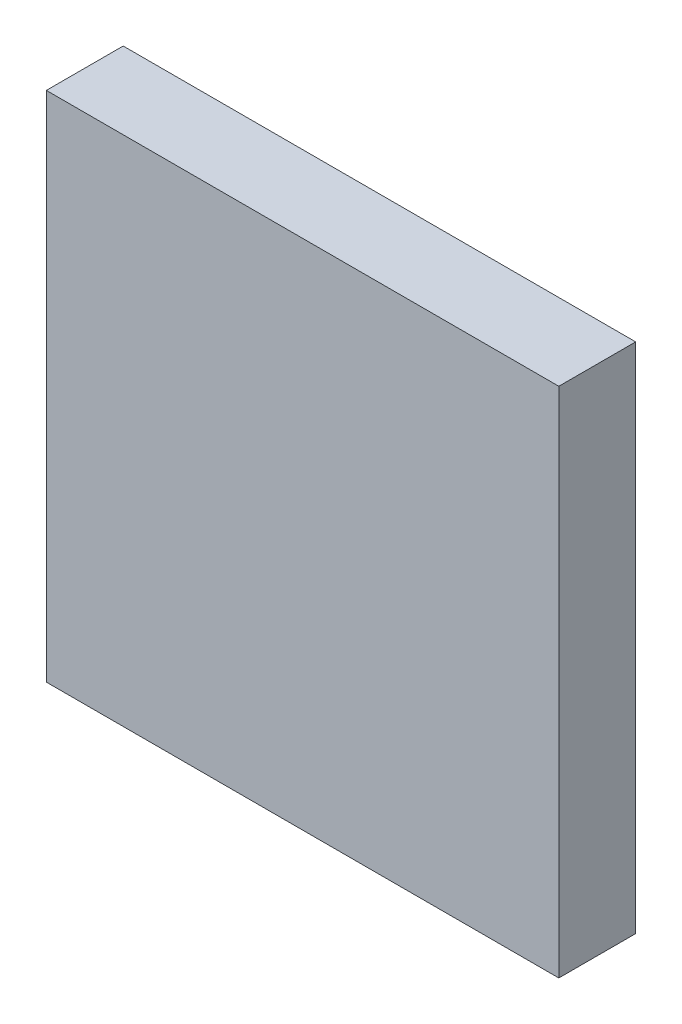
ISO-10303-21;
HEADER;
FILE_DESCRIPTION(('STEP AP214'),'2;1');
FILE_NAME('part.step','',(''),(''),'','','');
FILE_SCHEMA(('AUTOMOTIVE_DESIGN { 1 0 10303 214 1 1 1 1 }'));
ENDSEC;
DATA;
#1=APPLICATION_CONTEXT('core data for automotive mechanical design processes');
#2=APPLICATION_PROTOCOL_DEFINITION('international standard','automotive_design',2000,#1);
#3=PRODUCT_CONTEXT('',#1,'mechanical');
#4=PRODUCT('Part','Part','',(#3));
#5=PRODUCT_RELATED_PRODUCT_CATEGORY('part','',(#4));
#6=PRODUCT_DEFINITION_FORMATION('','',#4);
#7=PRODUCT_DEFINITION_CONTEXT('part definition',#1,'design');
#8=PRODUCT_DEFINITION('design','',#6,#7);
#9=PRODUCT_DEFINITION_SHAPE('','',#8);
#10=(LENGTH_UNIT() NAMED_UNIT(*) SI_UNIT(.MILLI.,.METRE.));
#11=(NAMED_UNIT(*) PLANE_ANGLE_UNIT() SI_UNIT($,.RADIAN.));
#12=(NAMED_UNIT(*) SI_UNIT($,.STERADIAN.) SOLID_ANGLE_UNIT());
#13=UNCERTAINTY_MEASURE_WITH_UNIT(LENGTH_MEASURE(1.E-05),#10,'distance_accuracy_value','');
#14=(GEOMETRIC_REPRESENTATION_CONTEXT(3) GLOBAL_UNCERTAINTY_ASSIGNED_CONTEXT((#13)) GLOBAL_UNIT_ASSIGNED_CONTEXT((#10,
#11,#12)) REPRESENTATION_CONTEXT('',''));
#15=CARTESIAN_POINT('',(0.,0.,0.));
#16=DIRECTION('',(0.,0.,1.));
#17=DIRECTION('',(1.,0.,0.));
#18=AXIS2_PLACEMENT_3D('',#15,#16,#17);
#19=CARTESIAN_POINT('',(-0.05801756530996,-0.437182539702,4.054679934551));
#20=DIRECTION('',(0.,0.,-1.));
#21=DIRECTION('',(0.,1.,0.));
#22=AXIS2_PLACEMENT_3D('',#19,#20,#21);
#23=PLANE('',#22);
#24=DIRECTION('',(0.,-1.,0.));
#25=VECTOR('',#24,1.);
#26=CARTESIAN_POINT('',(-3.05801756531,-0.437182539702,4.054679934551));
#27=LINE('',#26,#25);
#28=CARTESIAN_POINT('',(-3.05801756531,-3.437182539702,4.054679934551));
#29=VERTEX_POINT('',#28);
#30=CARTESIAN_POINT('',(-3.05801756531,2.562817460298,4.054679934551));
#31=VERTEX_POINT('',#30);
#32=EDGE_CURVE('E20',#29,#31,#27,.F.);
#33=ORIENTED_EDGE('',*,*,#32,.F.);
#34=DIRECTION('',(1.,0.,0.));
#35=VECTOR('',#34,1.);
#36=CARTESIAN_POINT('',(-0.05801756530996,-3.437182539702,4.054679934551));
#37=LINE('',#36,#35);
#38=CARTESIAN_POINT('',(2.94198243469,-3.437182539702,4.054679934551));
#39=VERTEX_POINT('',#38);
#40=EDGE_CURVE('E80',#39,#29,#37,.F.);
#41=ORIENTED_EDGE('',*,*,#40,.F.);
#42=DIRECTION('',(0.,1.,0.));
#43=VECTOR('',#42,1.);
#44=CARTESIAN_POINT('',(2.94198243469,-0.437182539702,4.054679934551));
#45=LINE('',#44,#43);
#46=CARTESIAN_POINT('',(2.94198243469,2.562817460298,4.054679934551));
#47=VERTEX_POINT('',#46);
#48=EDGE_CURVE('E68',#47,#39,#45,.F.);
#49=ORIENTED_EDGE('',*,*,#48,.F.);
#50=DIRECTION('',(1.,0.,0.));
#51=VECTOR('',#50,1.);
#52=CARTESIAN_POINT('',(-0.05801756530996,2.562817460298,4.054679934551));
#53=LINE('',#52,#51);
#54=EDGE_CURVE('E55',#31,#47,#53,.T.);
#55=ORIENTED_EDGE('',*,*,#54,.F.);
#56=EDGE_LOOP('',(#33,#41,#49,#55));
#57=FACE_BOUND('',#56,.T.);
#58=ADVANCED_FACE('F17',(#57),#23,.F.);
#59=CARTESIAN_POINT('',(-3.05801756531,-0.437182539702,4.054679934551));
#60=DIRECTION('',(-1.,0.,0.));
#61=DIRECTION('',(0.,-1.,0.));
#62=AXIS2_PLACEMENT_3D('',#59,#60,#61);
#63=PLANE('',#62);
#64=ORIENTED_EDGE('',*,*,#32,.T.);
#65=DIRECTION('',(0.,0.,1.));
#66=VECTOR('',#65,1.);
#67=CARTESIAN_POINT('',(-3.05801756531,2.562817460298,4.054679934551));
#68=LINE('',#67,#66);
#69=CARTESIAN_POINT('',(-3.05801756531,2.562817460298,3.154679934551));
#70=VERTEX_POINT('',#69);
#71=EDGE_CURVE('E61',#70,#31,#68,.T.);
#72=ORIENTED_EDGE('',*,*,#71,.F.);
#73=DIRECTION('',(0.,1.,0.));
#74=VECTOR('',#73,1.);
#75=CARTESIAN_POINT('',(-3.05801756531,-0.437182539702,3.154679934551));
#76=LINE('',#75,#74);
#77=CARTESIAN_POINT('',(-3.05801756531,-3.437182539702,3.154679934551));
#78=VERTEX_POINT('',#77);
#79=EDGE_CURVE('E83',#78,#70,#76,.T.);
#80=ORIENTED_EDGE('',*,*,#79,.F.);
#81=DIRECTION('',(0.,0.,-1.));
#82=VECTOR('',#81,1.);
#83=CARTESIAN_POINT('',(-3.05801756531,-3.437182539702,4.054679934551));
#84=LINE('',#83,#82);
#85=EDGE_CURVE('E64',#29,#78,#84,.T.);
#86=ORIENTED_EDGE('',*,*,#85,.F.);
#87=EDGE_LOOP('',(#64,#72,#80,#86));
#88=FACE_BOUND('',#87,.T.);
#89=ADVANCED_FACE('F60',(#88),#63,.T.);
#90=CARTESIAN_POINT('',(-0.05801756530996,2.562817460298,4.054679934551));
#91=DIRECTION('',(0.,1.,0.));
#92=DIRECTION('',(0.,0.,1.));
#93=AXIS2_PLACEMENT_3D('',#90,#91,#92);
#94=PLANE('',#93);
#95=ORIENTED_EDGE('',*,*,#54,.T.);
#96=DIRECTION('',(0.,0.,1.));
#97=VECTOR('',#96,1.);
#98=CARTESIAN_POINT('',(2.94198243469,2.562817460298,4.054679934551));
#99=LINE('',#98,#97);
#100=CARTESIAN_POINT('',(2.94198243469,2.562817460298,3.154679934551));
#101=VERTEX_POINT('',#100);
#102=EDGE_CURVE('E70',#101,#47,#99,.T.);
#103=ORIENTED_EDGE('',*,*,#102,.F.);
#104=DIRECTION('',(1.,0.,0.));
#105=VECTOR('',#104,1.);
#106=CARTESIAN_POINT('',(-0.05801756530996,2.562817460298,3.154679934551));
#107=LINE('',#106,#105);
#108=EDGE_CURVE('E74',#70,#101,#107,.T.);
#109=ORIENTED_EDGE('',*,*,#108,.F.);
#110=ORIENTED_EDGE('',*,*,#71,.T.);
#111=EDGE_LOOP('',(#95,#103,#109,#110));
#112=FACE_BOUND('',#111,.T.);
#113=ADVANCED_FACE('F72',(#112),#94,.T.);
#114=CARTESIAN_POINT('',(2.94198243469,-0.437182539702,4.054679934551));
#115=DIRECTION('',(1.,0.,0.));
#116=DIRECTION('',(0.,1.,0.));
#117=AXIS2_PLACEMENT_3D('',#114,#115,#116);
#118=PLANE('',#117);
#119=ORIENTED_EDGE('',*,*,#48,.T.);
#120=DIRECTION('',(0.,0.,-1.));
#121=VECTOR('',#120,1.);
#122=CARTESIAN_POINT('',(2.94198243469,-3.437182539702,4.054679934551));
#123=LINE('',#122,#121);
#124=CARTESIAN_POINT('',(2.94198243469,-3.437182539702,3.154679934551));
#125=VERTEX_POINT('',#124);
#126=EDGE_CURVE('E35',#125,#39,#123,.F.);
#127=ORIENTED_EDGE('',*,*,#126,.F.);
#128=DIRECTION('',(0.,1.,0.));
#129=VECTOR('',#128,1.);
#130=CARTESIAN_POINT('',(2.94198243469,-0.437182539702,3.154679934551));
#131=LINE('',#130,#129);
#132=EDGE_CURVE('E26',#101,#125,#131,.F.);
#133=ORIENTED_EDGE('',*,*,#132,.F.);
#134=ORIENTED_EDGE('',*,*,#102,.T.);
#135=EDGE_LOOP('',(#119,#127,#133,#134));
#136=FACE_BOUND('',#135,.T.);
#137=ADVANCED_FACE('F89',(#136),#118,.T.);
#138=CARTESIAN_POINT('',(-0.05801756530996,-3.437182539702,4.054679934551));
#139=DIRECTION('',(0.,-1.,0.));
#140=DIRECTION('',(0.,0.,-1.));
#141=AXIS2_PLACEMENT_3D('',#138,#139,#140);
#142=PLANE('',#141);
#143=ORIENTED_EDGE('',*,*,#40,.T.);
#144=ORIENTED_EDGE('',*,*,#85,.T.);
#145=DIRECTION('',(1.,0.,0.));
#146=VECTOR('',#145,1.);
#147=CARTESIAN_POINT('',(-0.05801756530996,-3.437182539702,3.154679934551));
#148=LINE('',#147,#146);
#149=EDGE_CURVE('E11',#125,#78,#148,.F.);
#150=ORIENTED_EDGE('',*,*,#149,.F.);
#151=ORIENTED_EDGE('',*,*,#126,.T.);
#152=EDGE_LOOP('',(#143,#144,#150,#151));
#153=FACE_BOUND('',#152,.T.);
#154=ADVANCED_FACE('F91',(#153),#142,.T.);
#155=CARTESIAN_POINT('',(-0.05801756530996,-0.437182539702,3.154679934551));
#156=DIRECTION('',(0.,0.,-1.));
#157=DIRECTION('',(0.,1.,0.));
#158=AXIS2_PLACEMENT_3D('',#155,#156,#157);
#159=PLANE('',#158);
#160=ORIENTED_EDGE('',*,*,#132,.T.);
#161=ORIENTED_EDGE('',*,*,#149,.T.);
#162=ORIENTED_EDGE('',*,*,#79,.T.);
#163=ORIENTED_EDGE('',*,*,#108,.T.);
#164=EDGE_LOOP('',(#160,#161,#162,#163));
#165=FACE_BOUND('',#164,.T.);
#166=ADVANCED_FACE('F88',(#165),#159,.T.);
#167=CLOSED_SHELL('',(#58,#89,#113,#137,#154,#166));
#168=MANIFOLD_SOLID_BREP('B1',#167);
#169=ADVANCED_BREP_SHAPE_REPRESENTATION('',(#18,#168),#14);
#170=SHAPE_DEFINITION_REPRESENTATION(#9,#169);
ENDSEC;
END-ISO-10303-21;
